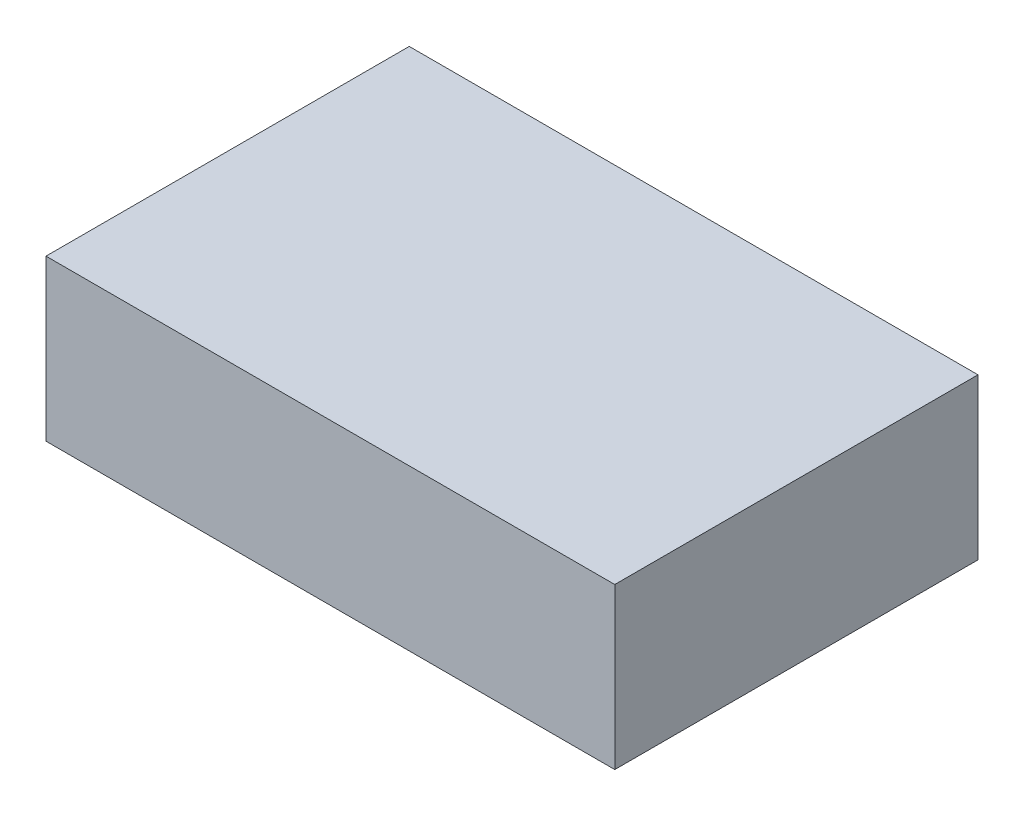
ISO-10303-21;
HEADER;
FILE_DESCRIPTION(('STEP AP214'),'2;1');
FILE_NAME('part.step','',(''),(''),'','','');
FILE_SCHEMA(('AUTOMOTIVE_DESIGN { 1 0 10303 214 1 1 1 1 }'));
ENDSEC;
DATA;
#1=APPLICATION_CONTEXT('core data for automotive mechanical design processes');
#2=APPLICATION_PROTOCOL_DEFINITION('international standard','automotive_design',2000,#1);
#3=PRODUCT_CONTEXT('',#1,'mechanical');
#4=PRODUCT('Part','Part','',(#3));
#5=PRODUCT_RELATED_PRODUCT_CATEGORY('part','',(#4));
#6=PRODUCT_DEFINITION_FORMATION('','',#4);
#7=PRODUCT_DEFINITION_CONTEXT('part definition',#1,'design');
#8=PRODUCT_DEFINITION('design','',#6,#7);
#9=PRODUCT_DEFINITION_SHAPE('','',#8);
#10=(LENGTH_UNIT() NAMED_UNIT(*) SI_UNIT(.MILLI.,.METRE.));
#11=(NAMED_UNIT(*) PLANE_ANGLE_UNIT() SI_UNIT($,.RADIAN.));
#12=(NAMED_UNIT(*) SI_UNIT($,.STERADIAN.) SOLID_ANGLE_UNIT());
#13=UNCERTAINTY_MEASURE_WITH_UNIT(LENGTH_MEASURE(1.E-05),#10,'distance_accuracy_value','');
#14=(GEOMETRIC_REPRESENTATION_CONTEXT(3) GLOBAL_UNCERTAINTY_ASSIGNED_CONTEXT((#13)) GLOBAL_UNIT_ASSIGNED_CONTEXT((#10,
#11,#12)) REPRESENTATION_CONTEXT('',''));
#15=CARTESIAN_POINT('',(0.,0.,0.));
#16=DIRECTION('',(0.,0.,1.));
#17=DIRECTION('',(1.,0.,0.));
#18=AXIS2_PLACEMENT_3D('',#15,#16,#17);
#19=CARTESIAN_POINT('',(0.,24.8,0.));
#20=DIRECTION('',(1.,0.,0.));
#21=DIRECTION('',(0.,0.,-1.));
#22=AXIS2_PLACEMENT_3D('',#19,#20,#21);
#23=PLANE('',#22);
#24=DIRECTION('',(0.,0.,1.));
#25=VECTOR('',#24,1.);
#26=CARTESIAN_POINT('',(0.,0.,0.));
#27=LINE('',#26,#25);
#28=CARTESIAN_POINT('',(0.,0.,-56.2));
#29=VERTEX_POINT('',#28);
#30=CARTESIAN_POINT('',(0.,0.,0.));
#31=VERTEX_POINT('',#30);
#32=EDGE_CURVE('E102',#29,#31,#27,.T.);
#33=ORIENTED_EDGE('',*,*,#32,.T.);
#34=DIRECTION('',(0.,-1.,0.));
#35=VECTOR('',#34,1.);
#36=CARTESIAN_POINT('',(0.,24.8,0.));
#37=LINE('',#36,#35);
#38=CARTESIAN_POINT('',(0.,24.8,0.));
#39=VERTEX_POINT('',#38);
#40=EDGE_CURVE('E11',#39,#31,#37,.T.);
#41=ORIENTED_EDGE('',*,*,#40,.F.);
#42=DIRECTION('',(0.,0.,1.));
#43=VECTOR('',#42,1.);
#44=CARTESIAN_POINT('',(0.,24.8,0.));
#45=LINE('',#44,#43);
#46=CARTESIAN_POINT('',(0.,24.8,-56.2));
#47=VERTEX_POINT('',#46);
#48=EDGE_CURVE('E90',#47,#39,#45,.T.);
#49=ORIENTED_EDGE('',*,*,#48,.F.);
#50=DIRECTION('',(0.,-1.,0.));
#51=VECTOR('',#50,1.);
#52=CARTESIAN_POINT('',(0.,24.8,-56.2));
#53=LINE('',#52,#51);
#54=EDGE_CURVE('E98',#47,#29,#53,.T.);
#55=ORIENTED_EDGE('',*,*,#54,.T.);
#56=EDGE_LOOP('',(#33,#41,#49,#55));
#57=FACE_BOUND('',#56,.T.);
#58=ADVANCED_FACE('F39',(#57),#23,.F.);
#59=CARTESIAN_POINT('',(0.,24.8,0.));
#60=DIRECTION('',(0.,0.,-1.));
#61=DIRECTION('',(-1.,0.,0.));
#62=AXIS2_PLACEMENT_3D('',#59,#60,#61);
#63=PLANE('',#62);
#64=DIRECTION('',(1.,0.,0.));
#65=VECTOR('',#64,1.);
#66=CARTESIAN_POINT('',(0.,0.,0.));
#67=LINE('',#66,#65);
#68=CARTESIAN_POINT('',(88.,0.,0.));
#69=VERTEX_POINT('',#68);
#70=EDGE_CURVE('E94',#31,#69,#67,.T.);
#71=ORIENTED_EDGE('',*,*,#70,.T.);
#72=DIRECTION('',(0.,-1.,0.));
#73=VECTOR('',#72,1.);
#74=CARTESIAN_POINT('',(88.,24.8,0.));
#75=LINE('',#74,#73);
#76=CARTESIAN_POINT('',(88.,24.8,0.));
#77=VERTEX_POINT('',#76);
#78=EDGE_CURVE('E47',#77,#69,#75,.T.);
#79=ORIENTED_EDGE('',*,*,#78,.F.);
#80=DIRECTION('',(1.,0.,0.));
#81=VECTOR('',#80,1.);
#82=CARTESIAN_POINT('',(0.,24.8,0.));
#83=LINE('',#82,#81);
#84=EDGE_CURVE('E85',#39,#77,#83,.T.);
#85=ORIENTED_EDGE('',*,*,#84,.F.);
#86=ORIENTED_EDGE('',*,*,#40,.T.);
#87=EDGE_LOOP('',(#71,#79,#85,#86));
#88=FACE_BOUND('',#87,.T.);
#89=ADVANCED_FACE('F93',(#88),#63,.F.);
#90=CARTESIAN_POINT('',(88.,24.8,0.));
#91=DIRECTION('',(-1.,0.,0.));
#92=DIRECTION('',(0.,0.,1.));
#93=AXIS2_PLACEMENT_3D('',#90,#91,#92);
#94=PLANE('',#93);
#95=DIRECTION('',(0.,0.,-1.));
#96=VECTOR('',#95,1.);
#97=CARTESIAN_POINT('',(88.,0.,0.));
#98=LINE('',#97,#96);
#99=CARTESIAN_POINT('',(88.,0.,-56.2));
#100=VERTEX_POINT('',#99);
#101=EDGE_CURVE('E72',#69,#100,#98,.T.);
#102=ORIENTED_EDGE('',*,*,#101,.T.);
#103=DIRECTION('',(0.,-1.,0.));
#104=VECTOR('',#103,1.);
#105=CARTESIAN_POINT('',(88.,24.8,-56.2));
#106=LINE('',#105,#104);
#107=CARTESIAN_POINT('',(88.,24.8,-56.2));
#108=VERTEX_POINT('',#107);
#109=EDGE_CURVE('E95',#108,#100,#106,.T.);
#110=ORIENTED_EDGE('',*,*,#109,.F.);
#111=DIRECTION('',(0.,0.,-1.));
#112=VECTOR('',#111,1.);
#113=CARTESIAN_POINT('',(88.,24.8,0.));
#114=LINE('',#113,#112);
#115=EDGE_CURVE('E88',#77,#108,#114,.T.);
#116=ORIENTED_EDGE('',*,*,#115,.F.);
#117=ORIENTED_EDGE('',*,*,#78,.T.);
#118=EDGE_LOOP('',(#102,#110,#116,#117));
#119=FACE_BOUND('',#118,.T.);
#120=ADVANCED_FACE('F96',(#119),#94,.F.);
#121=CARTESIAN_POINT('',(0.,24.8,-56.2));
#122=DIRECTION('',(0.,0.,1.));
#123=DIRECTION('',(1.,0.,0.));
#124=AXIS2_PLACEMENT_3D('',#121,#122,#123);
#125=PLANE('',#124);
#126=DIRECTION('',(-1.,0.,0.));
#127=VECTOR('',#126,1.);
#128=CARTESIAN_POINT('',(0.,0.,-56.2));
#129=LINE('',#128,#127);
#130=EDGE_CURVE('E78',#100,#29,#129,.T.);
#131=ORIENTED_EDGE('',*,*,#130,.T.);
#132=ORIENTED_EDGE('',*,*,#54,.F.);
#133=DIRECTION('',(-1.,0.,0.));
#134=VECTOR('',#133,1.);
#135=CARTESIAN_POINT('',(0.,24.8,-56.2));
#136=LINE('',#135,#134);
#137=EDGE_CURVE('E55',#108,#47,#136,.T.);
#138=ORIENTED_EDGE('',*,*,#137,.F.);
#139=ORIENTED_EDGE('',*,*,#109,.T.);
#140=EDGE_LOOP('',(#131,#132,#138,#139));
#141=FACE_BOUND('',#140,.T.);
#142=ADVANCED_FACE('F109',(#141),#125,.F.);
#143=CARTESIAN_POINT('',(0.,24.8,0.));
#144=DIRECTION('',(0.,-1.,0.));
#145=DIRECTION('',(0.,0.,-1.));
#146=AXIS2_PLACEMENT_3D('',#143,#144,#145);
#147=PLANE('',#146);
#148=ORIENTED_EDGE('',*,*,#48,.T.);
#149=ORIENTED_EDGE('',*,*,#84,.T.);
#150=ORIENTED_EDGE('',*,*,#115,.T.);
#151=ORIENTED_EDGE('',*,*,#137,.T.);
#152=EDGE_LOOP('',(#148,#149,#150,#151));
#153=FACE_BOUND('',#152,.T.);
#154=ADVANCED_FACE('F86',(#153),#147,.F.);
#155=CARTESIAN_POINT('',(0.,0.,0.));
#156=DIRECTION('',(0.,-1.,0.));
#157=DIRECTION('',(0.,0.,-1.));
#158=AXIS2_PLACEMENT_3D('',#155,#156,#157);
#159=PLANE('',#158);
#160=ORIENTED_EDGE('',*,*,#32,.F.);
#161=ORIENTED_EDGE('',*,*,#130,.F.);
#162=ORIENTED_EDGE('',*,*,#101,.F.);
#163=ORIENTED_EDGE('',*,*,#70,.F.);
#164=EDGE_LOOP('',(#160,#161,#162,#163));
#165=FACE_BOUND('',#164,.T.);
#166=ADVANCED_FACE('F112',(#165),#159,.T.);
#167=CLOSED_SHELL('',(#58,#89,#120,#142,#154,#166));
#168=MANIFOLD_SOLID_BREP('B2',#167);
#169=ADVANCED_BREP_SHAPE_REPRESENTATION('',(#18,#168),#14);
#170=SHAPE_DEFINITION_REPRESENTATION(#9,#169);
ENDSEC;
END-ISO-10303-21;
